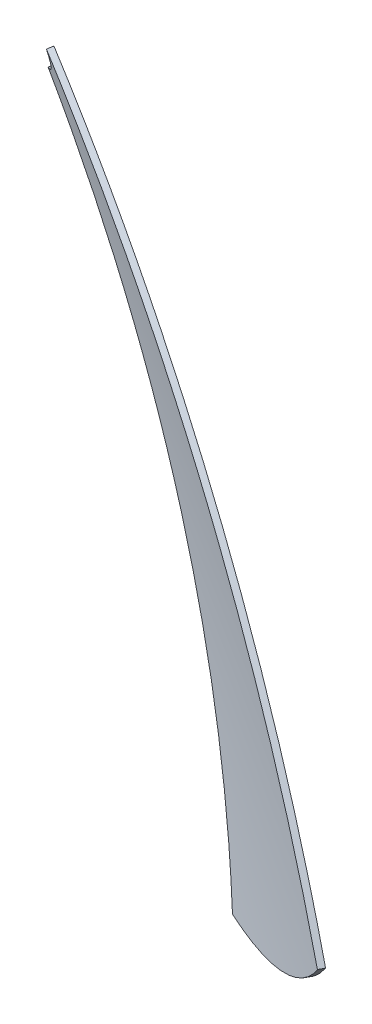
ISO-10303-21;
HEADER;
FILE_DESCRIPTION(('STEP AP214'),'2;1');
FILE_NAME('part.step','',(''),(''),'','','');
FILE_SCHEMA(('AUTOMOTIVE_DESIGN { 1 0 10303 214 1 1 1 1 }'));
ENDSEC;
DATA;
#1=APPLICATION_CONTEXT('core data for automotive mechanical design processes');
#2=APPLICATION_PROTOCOL_DEFINITION('international standard','automotive_design',2000,#1);
#3=PRODUCT_CONTEXT('',#1,'mechanical');
#4=PRODUCT('Part','Part','',(#3));
#5=PRODUCT_RELATED_PRODUCT_CATEGORY('part','',(#4));
#6=PRODUCT_DEFINITION_FORMATION('','',#4);
#7=PRODUCT_DEFINITION_CONTEXT('part definition',#1,'design');
#8=PRODUCT_DEFINITION('design','',#6,#7);
#9=PRODUCT_DEFINITION_SHAPE('','',#8);
#10=(LENGTH_UNIT() NAMED_UNIT(*) SI_UNIT(.MILLI.,.METRE.));
#11=(NAMED_UNIT(*) PLANE_ANGLE_UNIT() SI_UNIT($,.RADIAN.));
#12=(NAMED_UNIT(*) SI_UNIT($,.STERADIAN.) SOLID_ANGLE_UNIT());
#13=UNCERTAINTY_MEASURE_WITH_UNIT(LENGTH_MEASURE(1.E-05),#10,'distance_accuracy_value','');
#14=(GEOMETRIC_REPRESENTATION_CONTEXT(3) GLOBAL_UNCERTAINTY_ASSIGNED_CONTEXT((#13)) GLOBAL_UNIT_ASSIGNED_CONTEXT((#10,
#11,#12)) REPRESENTATION_CONTEXT('',''));
#15=CARTESIAN_POINT('',(0.,0.,0.));
#16=DIRECTION('',(0.,0.,1.));
#17=DIRECTION('',(1.,0.,0.));
#18=AXIS2_PLACEMENT_3D('',#15,#16,#17);
#19=CARTESIAN_POINT('',(92.8191394008508,-170.458872491296,-2.70380006520989));
#20=DIRECTION('',(0.,0.,1.));
#21=DIRECTION('',(1.,0.,0.));
#22=AXIS2_PLACEMENT_3D('',#19,#20,#21);
#23=CONICAL_SURFACE('',#22,60.5897364806191,0.959931088596881);
#24=CARTESIAN_POINT('',(152.398725099089,-159.865837266107,-2.75685890943688));
#25=CARTESIAN_POINT('',(152.336574594486,-159.74953897284,-2.78545030673104));
#26=CARTESIAN_POINT('',(152.274007170203,-159.633472462259,-2.81408465077512));
#27=CARTESIAN_POINT('',(151.959073791623,-159.054268987262,-2.95747727285969));
#28=CARTESIAN_POINT('',(151.700488657558,-158.594650234722,-3.07286613059215));
#29=CARTESIAN_POINT('',(151.170357344202,-157.683266643014,-3.30487159219547));
#30=CARTESIAN_POINT('',(150.898811179182,-157.231501795199,-3.42148819471435));
#31=CARTESIAN_POINT('',(150.48199364642,-156.560027960789,-3.59725956980415));
#32=CARTESIAN_POINT('',(150.34147682015,-156.337240420846,-3.65598890828657));
#33=CARTESIAN_POINT('',(149.91518196884,-155.671960401747,-3.832604308307));
#34=CARTESIAN_POINT('',(149.624679564232,-155.232583783193,-3.95090916930156));
#35=CARTESIAN_POINT('',(149.179708172621,-154.580088957937,-4.12913976000288));
#36=CARTESIAN_POINT('',(149.029853766096,-154.363693547814,-4.1886766334064));
#37=CARTESIAN_POINT('',(148.575674829862,-153.717788793499,-4.36768573612753));
#38=CARTESIAN_POINT('',(148.266756070885,-153.291593425314,-4.48754769873669));
#39=CARTESIAN_POINT('',(147.794412332155,-152.659280347937,-4.66807301856227));
#40=CARTESIAN_POINT('',(147.635476178773,-152.449680251862,-4.72836795087565));
#41=CARTESIAN_POINT('',(147.154168703976,-151.824384517337,-4.90964101311223));
#42=CARTESIAN_POINT('',(146.827321470728,-151.412225311476,-5.03099844670388));
#43=CARTESIAN_POINT('',(146.162024759803,-150.597669838701,-5.27461905538904));
#44=CARTESIAN_POINT('',(145.823575295453,-150.195273560573,-5.39688222944204));
#45=CARTESIAN_POINT('',(145.135410847417,-149.400473143817,-5.64218565509231));
#46=CARTESIAN_POINT('',(144.785695876165,-149.008068994161,-5.76522590583184));
#47=CARTESIAN_POINT('',(144.075317197601,-148.233518392532,-6.01197831877071));
#48=CARTESIAN_POINT('',(143.714653498024,-147.851371933312,-6.13569048049534));
#49=CARTESIAN_POINT('',(142.982682065742,-147.097606512934,-6.38369388464251));
#50=CARTESIAN_POINT('',(142.611374336475,-146.725987548375,-6.50798512687802));
#51=CARTESIAN_POINT('',(141.858406565963,-145.993561374871,-6.75707001258452));
#52=CARTESIAN_POINT('',(141.476746524202,-145.632754166468,-6.88186365608066));
#53=CARTESIAN_POINT('',(140.703363542617,-144.922252430132,-7.13188746750698));
#54=CARTESIAN_POINT('',(140.311640598607,-144.572557906822,-7.2571176356187));
#55=CARTESIAN_POINT('',(139.268389274935,-143.667767174082,-7.5870376220849));
#56=CARTESIAN_POINT('',(138.608735122322,-143.122138944729,-7.79205742776249));
#57=CARTESIAN_POINT('',(137.936618962161,-142.592357330095,-7.9975230269363));
#58=B_SPLINE_CURVE_WITH_KNOTS('',3,(#24,#25,#26,#27,#28,#29,#30,#31,#32,#33,#34,#35,#36,#37,#38,
#39,#40,#41,#42,#43,#44,#45,#46,#47,#48,#49,#50,#51,#52,#53,#54,#55,#56,#57),.UNSPECIFIED.,.F.,
.F.,(4,2,2,2,2,2,2,2,2,2,2,2,2,2,2,2,4),(0.,0.404785672243409,2.02408011369018,3.64337277215144,
4.45295892626697,6.07225043051863,6.88183655836591,8.50112857030588,9.31071486961127,
10.9300085585706,12.5493003875806,14.1685904295217,15.7878793275896,17.4071677026849,
19.0264561588341,20.6457452885118,23.2857183735523),.UNSPECIFIED.);
#59=CARTESIAN_POINT('',(152.398725099089,-159.865837266107,-2.75685890943712));
#60=VERTEX_POINT('',#59);
#61=CARTESIAN_POINT('',(137.936618962161,-142.592357330095,-7.99752302693631));
#62=VERTEX_POINT('',#61);
#63=EDGE_CURVE('E24',#60,#62,#58,.T.);
#64=ORIENTED_EDGE('',*,*,#63,.T.);
#65=CARTESIAN_POINT('',(137.936618962161,-142.592357330095,-7.99752302693651));
#66=CARTESIAN_POINT('',(137.878655188416,-142.691117877138,-8.06839270908306));
#67=CARTESIAN_POINT('',(137.819617741669,-142.789062852767,-8.13954595753132));
#68=CARTESIAN_POINT('',(137.519032649565,-143.274933729614,-8.49686090490927));
#69=CARTESIAN_POINT('',(137.261797471396,-143.650420376312,-8.78704423252981));
#70=CARTESIAN_POINT('',(136.830097638421,-144.223886184292,-9.25266430869265));
#71=CARTESIAN_POINT('',(136.665365674693,-144.431088054902,-9.42595602925785));
#72=CARTESIAN_POINT('',(136.423589909647,-144.719474364407,-9.67445744911181));
#73=CARTESIAN_POINT('',(136.350508164119,-144.804702893336,-9.74885104371632));
#74=CARTESIAN_POINT('',(136.021734580683,-145.179648827516,-10.0804026850167));
#75=CARTESIAN_POINT('',(135.756637133949,-145.459610570795,-10.3394946224096));
#76=CARTESIAN_POINT('',(135.402488923798,-145.806205515317,-10.6757424971141));
#77=CARTESIAN_POINT('',(135.322043952983,-145.883206989514,-10.7514987942421));
#78=CARTESIAN_POINT('',(134.966556291844,-146.215979556731,-11.0835807574503));
#79=CARTESIAN_POINT('',(134.683372040856,-146.461724706624,-11.341189489594));
#80=CARTESIAN_POINT('',(134.391589489127,-146.696069718829,-11.59999961285));
#81=B_SPLINE_CURVE_WITH_KNOTS('',3,(#65,#66,#67,#68,#69,#70,#71,#72,#73,#74,#75,#76,#77,#78,#79,
#80),.UNSPECIFIED.,.F.,.F.,(4,2,2,2,2,2,2,4),(0.,0.404039967204577,2.0213893371491,
2.97026784667457,3.37430460638701,4.76665393130004,5.17069019074886,6.5348899023175),.UNSPECIFIED.);
#82=CARTESIAN_POINT('',(134.391589487326,-146.696069720275,-11.5999996144475));
#83=VERTEX_POINT('',#82);
#84=EDGE_CURVE('E119',#62,#83,#81,.T.);
#85=ORIENTED_EDGE('',*,*,#84,.T.);
#86=CARTESIAN_POINT('',(134.391589485174,-146.696069721107,-11.5999996160451));
#87=CARTESIAN_POINT('',(134.459223065915,-146.814392834561,-11.5999996494661));
#88=CARTESIAN_POINT('',(134.526346230582,-146.933010458471,-11.6000047399864));
#89=CARTESIAN_POINT('',(134.859436645656,-147.527610959313,-11.6000530761269));
#90=CARTESIAN_POINT('',(135.117713968651,-148.007933380415,-11.6001649766073));
#91=CARTESIAN_POINT('',(135.617595351562,-148.97715725202,-11.6004735845131));
#92=CARTESIAN_POINT('',(135.85919943346,-149.46605869121,-11.6006702918267));
#93=CARTESIAN_POINT('',(136.325527939011,-150.451850812253,-11.6010958966145));
#94=CARTESIAN_POINT('',(136.550252381414,-150.94874148523,-11.6013247940529));
#95=CARTESIAN_POINT('',(136.982611111302,-151.949896784708,-11.6017712994741));
#96=CARTESIAN_POINT('',(137.190245414073,-152.454161404612,-11.601988907467));
#97=CARTESIAN_POINT('',(137.588233436813,-153.469479078157,-11.6023789968116));
#98=CARTESIAN_POINT('',(137.778587168387,-153.980532127239,-11.6025514781935));
#99=CARTESIAN_POINT('',(138.050989897135,-154.751675125658,-11.6027589088274));
#100=CARTESIAN_POINT('',(138.139598371038,-155.009469232641,-11.6028195018998));
#101=CARTESIAN_POINT('',(138.398863578129,-155.785127838502,-11.6029726866678));
#102=CARTESIAN_POINT('',(138.562939521934,-156.305213380311,-11.6030366646335));
#103=CARTESIAN_POINT('',(138.87334208877,-157.350635536463,-11.603079962301));
#104=CARTESIAN_POINT('',(139.019668713544,-157.875972150291,-11.6030592820111));
#105=CARTESIAN_POINT('',(139.294410333238,-158.931327291594,-11.6029358242971));
#106=CARTESIAN_POINT('',(139.422825325769,-159.461345819693,-11.6028330468619));
#107=CARTESIAN_POINT('',(139.601871565522,-160.259347737563,-11.6026274061371));
#108=CARTESIAN_POINT('',(139.659288201137,-160.525829583005,-11.6025502856918));
#109=CARTESIAN_POINT('',(139.824744966156,-161.326759891165,-11.6022970818032));
#110=CARTESIAN_POINT('',(139.925977990564,-161.8626354976,-11.6020991678294));
#111=CARTESIAN_POINT('',(140.110120815624,-162.937508813756,-11.6016733387557));
#112=CARTESIAN_POINT('',(140.193030603348,-163.476506525681,-11.6014454236347));
#113=CARTESIAN_POINT('',(140.34038163197,-164.557038133445,-11.600998195146));
#114=CARTESIAN_POINT('',(140.404822855735,-165.098572031636,-11.6007788817863));
#115=CARTESIAN_POINT('',(140.48751821096,-165.912227151599,-11.6004924206113));
#116=CARTESIAN_POINT('',(140.512754582088,-166.183656322819,-11.6004040220442));
#117=CARTESIAN_POINT('',(140.593605376919,-167.142587342302,-11.6001296377139));
#118=CARTESIAN_POINT('',(140.636607484771,-167.831159861272,-11.6000013307998));
#119=CARTESIAN_POINT('',(140.664536458546,-168.520475756909,-11.5999996160449));
#120=B_SPLINE_CURVE_WITH_KNOTS('',3,(#86,#87,#88,#89,#90,#91,#92,#93,#94,#95,#96,#97,#98,#99,
#100,#101,#102,#103,#104,#105,#106,#107,#108,#109,#110,#111,#112,#113,#114,#115,#116,#117,#118,
#119),.UNSPECIFIED.,.F.,.F.,(4,2,2,2,2,2,2,2,2,2,2,2,2,2,2,2,4),(0.,0.408872020546568,
2.04458806965262,3.68030196204773,5.31601403746416,6.95172464991032,8.58743416394008,
9.40520006693931,11.0409086322748,12.6766170368721,14.3123256596369,15.1300915889362,
16.765801245756,18.4015120568192,20.0372243852957,20.8549909104281,22.9242005441191),.UNSPECIFIED.);
#121=CARTESIAN_POINT('',(140.664536469763,-168.520475770829,-11.5999996085915));
#122=VERTEX_POINT('',#121);
#123=EDGE_CURVE('E69',#83,#122,#120,.T.);
#124=ORIENTED_EDGE('',*,*,#123,.T.);
#125=CARTESIAN_POINT('',(140.66453648098,-168.52047578475,-11.5999996011381));
#126=CARTESIAN_POINT('',(140.767038748587,-168.472575513016,-11.5269277903223));
#127=CARTESIAN_POINT('',(140.869368199467,-168.424201120752,-11.4539216330642));
#128=CARTESIAN_POINT('',(141.175831959128,-168.27762831105,-11.2350974279839));
#129=CARTESIAN_POINT('',(141.379425587943,-168.177987600055,-11.0894850958437));
#130=CARTESIAN_POINT('',(141.683660307701,-168.025556504144,-10.8715027837715));
#131=CARTESIAN_POINT('',(141.784886240841,-167.974247472363,-10.798909691186));
#132=CARTESIAN_POINT('',(141.986938824597,-167.870633160813,-10.6538741764911));
#133=CARTESIAN_POINT('',(142.087765467761,-167.818327862555,-10.5814317572058));
#134=CARTESIAN_POINT('',(142.390106125375,-167.65962334684,-10.3639913364422));
#135=CARTESIAN_POINT('',(142.590986778269,-167.551682762367,-10.2192341296152));
#136=CARTESIAN_POINT('',(142.991044699274,-167.331869367407,-9.9303437311623));
#137=CARTESIAN_POINT('',(143.190221915021,-167.219996436574,-9.78621055878622));
#138=CARTESIAN_POINT('',(143.586962859633,-166.992689078319,-9.49848968027459));
#139=CARTESIAN_POINT('',(143.784526449946,-166.877254349046,-9.35490202153411));
#140=CARTESIAN_POINT('',(144.177854311792,-166.64259699039,-9.06835939814929));
#141=CARTESIAN_POINT('',(144.373618594788,-166.523374385158,-8.92540442947766));
#142=CARTESIAN_POINT('',(144.763203172076,-166.280999269041,-8.64018539033869));
#143=CARTESIAN_POINT('',(144.957023504199,-166.157846834826,-8.49792130645469));
#144=CARTESIAN_POINT('',(145.342610031487,-165.90755530137,-8.21412074792206));
#145=CARTESIAN_POINT('',(145.53437620973,-165.780416169318,-8.07258427927293));
#146=CARTESIAN_POINT('',(146.106460978821,-165.393134464185,-7.6491088988452));
#147=CARTESIAN_POINT('',(146.483623176014,-165.127091898231,-7.36826203253392));
#148=CARTESIAN_POINT('',(147.04228371928,-164.717129671576,-6.94955383041514));
#149=CARTESIAN_POINT('',(147.227105055462,-164.578832322114,-6.81057731815191));
#150=CARTESIAN_POINT('',(147.594480572017,-164.298576195226,-6.53337820036422));
#151=CARTESIAN_POINT('',(147.777035009052,-164.156617838009,-6.39515551050309));
#152=CARTESIAN_POINT('',(148.321259609538,-163.725295322442,-5.98159483376346));
#153=CARTESIAN_POINT('',(148.679482383748,-163.430490089926,-5.70737074101098));
#154=CARTESIAN_POINT('',(149.38618013266,-162.826662747187,-5.16201900366931));
#155=CARTESIAN_POINT('',(149.734655084881,-162.51764060418,-4.89089136622257));
#156=CARTESIAN_POINT('',(150.249533314542,-162.043581954401,-4.48668211090644));
#157=CARTESIAN_POINT('',(150.419845446589,-161.883816342183,-4.35236598634263));
#158=CARTESIAN_POINT('',(150.899853402461,-161.424964290071,-3.97199681635292));
#159=CARTESIAN_POINT('',(151.206348153925,-161.121676738571,-3.72694448823466));
#160=CARTESIAN_POINT('',(151.809884374017,-160.502871268378,-3.23966273935938));
#161=CARTESIAN_POINT('',(152.106916132354,-160.187341479762,-2.99743637027885));
#162=CARTESIAN_POINT('',(152.398725099089,-159.865837266107,-2.75685890943743));
#163=B_SPLINE_CURVE_WITH_KNOTS('',3,(#125,#126,#127,#128,#129,#130,#131,#132,#133,#134,#135,
#136,#137,#138,#139,#140,#141,#142,#143,#144,#145,#146,#147,#148,#149,#150,#151,#152,#153,#154,
#155,#156,#157,#158,#159,#160,#161,#162),.UNSPECIFIED.,.F.,.F.,(4,2,2,2,2,2,2,2,2,2,2,2,2,2,2,2,
2,2,4),(0.,0.404064075306683,1.21225541412365,1.61640714753914,2.02056638872021,2.8308531042915,
3.64116463957878,4.45154503581638,5.26192026625542,6.07227969613828,6.8826457970962,
8.50313948334857,9.31144133405106,10.1196508173615,11.7361074941069,13.3525678987026,
14.1607180190769,15.6483257506211,17.1374137757609),.UNSPECIFIED.);
#164=EDGE_CURVE('E66',#122,#60,#163,.T.);
#165=ORIENTED_EDGE('',*,*,#164,.T.);
#166=EDGE_LOOP('',(#64,#85,#124,#165));
#167=FACE_BOUND('',#166,.T.);
#168=ADVANCED_FACE('F17',(#167),#23,.F.);
#169=CARTESIAN_POINT('',(138.035194653809,-142.531472701066,-8.16299173988277));
#170=CARTESIAN_POINT('',(138.034869321493,-142.531673640436,-8.16244563851991));
#171=CARTESIAN_POINT('',(138.034543989178,-142.531874579805,-8.16189953715705));
#172=CARTESIAN_POINT('',(138.034218656862,-142.532075519175,-8.16135343579419));
#173=CARTESIAN_POINT('',(138.001685425295,-142.552169456148,-8.10674329950826));
#174=CARTESIAN_POINT('',(137.969152193728,-142.572263393121,-8.05213316322233));
#175=CARTESIAN_POINT('',(137.936618962161,-142.592357330095,-7.9975230269364));
#176=CARTESIAN_POINT('',(141.425652158464,-145.207697592243,-7.12789737510283));
#177=CARTESIAN_POINT('',(141.425311467521,-145.20787367337,-7.12735127373997));
#178=CARTESIAN_POINT('',(141.424970776578,-145.208049754496,-7.12680517237711));
#179=CARTESIAN_POINT('',(141.424630085635,-145.208225835622,-7.12625907101425));
#180=CARTESIAN_POINT('',(141.390560991334,-145.22583394824,-7.07164893472832));
#181=CARTESIAN_POINT('',(141.356495909054,-145.243446081167,-7.01703879844239));
#182=CARTESIAN_POINT('',(141.322426814753,-145.261054193784,-6.96242866215646));
#183=CARTESIAN_POINT('',(146.855040655157,-150.64180884318,-5.31572204899934));
#184=CARTESIAN_POINT('',(146.854679006679,-150.641939790435,-5.31517594763648));
#185=CARTESIAN_POINT('',(146.854317358202,-150.642070737691,-5.31462984627362));
#186=CARTESIAN_POINT('',(146.853955709725,-150.642201684947,-5.31408374491076));
#187=CARTESIAN_POINT('',(146.817790862002,-150.655296410524,-5.25947360862483));
#188=CARTESIAN_POINT('',(146.781624590779,-150.66838936418,-5.2048634723389));
#189=CARTESIAN_POINT('',(146.745459743057,-150.681484089757,-5.15025333605297));
#190=CARTESIAN_POINT('',(151.003371937059,-157.017228221913,-3.61624611019748));
#191=CARTESIAN_POINT('',(151.002998821613,-157.017314088397,-3.61570000883462));
#192=CARTESIAN_POINT('',(151.002625706167,-157.017399954881,-3.61515390747176));
#193=CARTESIAN_POINT('',(151.002252590721,-157.017485821364,-3.6146078061089));
#194=CARTESIAN_POINT('',(150.96494104612,-157.026072469715,-3.55999766982296));
#195=CARTESIAN_POINT('',(150.927629938759,-157.034659808316,-3.50538753353703));
#196=CARTESIAN_POINT('',(150.890318394158,-157.043246456667,-3.4507773972511));
#197=CARTESIAN_POINT('',(152.512798547818,-159.845555418784,-2.92232762238332));
#198=CARTESIAN_POINT('',(152.51242206779,-159.845622355574,-2.92178152102046));
#199=CARTESIAN_POINT('',(152.512045587761,-159.845689292364,-2.9212354196576));
#200=CARTESIAN_POINT('',(152.511669107732,-159.845756229154,-2.92068931829474));
#201=CARTESIAN_POINT('',(152.474021104851,-159.852449908139,-2.8660791820088));
#202=CARTESIAN_POINT('',(152.43637310197,-159.859143587123,-2.81146904572287));
#203=CARTESIAN_POINT('',(152.398725099089,-159.865837266107,-2.75685890943694));
#204=B_SPLINE_SURFACE_WITH_KNOTS('',3,3,((#169,#170,#171,#172,#173,#174,#175),(#176,#177,#178,
#179,#180,#181,#182),(#183,#184,#185,#186,#187,#188,#189),(#190,#191,#192,#193,#194,#195,#196),
(#197,#198,#199,#200,#201,#202,#203)),.UNSPECIFIED.,.F.,.F.,.F.,(4,1,4),(4,3,4),(0.,
0.571428571428571,1.),(-0.01,0.,1.),.UNSPECIFIED.);
#205=DIRECTION('',(-0.487998473505722,-0.301409054594844,0.819152044289903));
#206=VECTOR('',#205,1.);
#207=CARTESIAN_POINT('',(137.984930811038,-142.562517833689,-8.078619079321));
#208=LINE('',#207,#206);
#209=CARTESIAN_POINT('',(138.031955557124,-142.53347400915,-8.15755361789342));
#210=VERTEX_POINT('',#209);
#211=EDGE_CURVE('E78',#210,#62,#208,.T.);
#212=DIRECTION('',(0.564720043215892,0.100405184759886,-0.819152044289443));
#213=VECTOR('',#212,1.);
#214=CARTESIAN_POINT('',(152.45519710341,-159.855796747631,-2.83877411386612));
#215=LINE('',#214,#213);
#216=CARTESIAN_POINT('',(152.511669113722,-159.845756222542,-2.92068931335494));
#217=VERTEX_POINT('',#216);
#218=EDGE_CURVE('E73',#60,#217,#215,.T.);
#219=CARTESIAN_POINT('',(138.031956055694,-142.533474402486,-8.15755346593899));
#220=CARTESIAN_POINT('',(138.133958108076,-142.613946645847,-8.12646529778272));
#221=CARTESIAN_POINT('',(138.23567539827,-142.694786061121,-8.09538663597653));
#222=CARTESIAN_POINT('',(138.74286271387,-143.100834171666,-7.94003119367087));
#223=CARTESIAN_POINT('',(139.144024853123,-143.431509233597,-7.81590162897688));
#224=CARTESIAN_POINT('',(139.936854598686,-144.104159723405,-7.56799587909311));
#225=CARTESIAN_POINT('',(140.328522214568,-144.446135139888,-7.44421969354719));
#226=CARTESIAN_POINT('',(141.10211009576,-145.141087209682,-7.19705770055076));
#227=CARTESIAN_POINT('',(141.484030367544,-145.494063855684,-7.07367189284102));
#228=CARTESIAN_POINT('',(142.23782948686,-146.210700728621,-6.82735417547374));
#229=CARTESIAN_POINT('',(142.609708337591,-146.574360952152,-6.70442226567162));
#230=CARTESIAN_POINT('',(143.710179152728,-147.681262017949,-6.33630065434827));
#231=CARTESIAN_POINT('',(144.423385897111,-148.440226051676,-6.0918551660268));
#232=CARTESIAN_POINT('',(145.460231152539,-149.608073277219,-5.72736513781131));
#233=CARTESIAN_POINT('',(145.80030642686,-150.002198188563,-5.60624843437447));
#234=CARTESIAN_POINT('',(146.469268050778,-150.800116367013,-5.36481666759996));
#235=CARTESIAN_POINT('',(146.798154387625,-151.203909645135,-5.24450160517589));
#236=CARTESIAN_POINT('',(147.282792001451,-151.816615278646,-5.06474493323933));
#237=CARTESIAN_POINT('',(147.44288360914,-152.02201224439,-5.00494750580863));
#238=CARTESIAN_POINT('',(147.918821995925,-152.641709406603,-4.8258995493583));
#239=CARTESIAN_POINT('',(148.230308492053,-153.05948658805,-4.7070020684499));
#240=CARTESIAN_POINT('',(148.688602686994,-153.692743102929,-4.52940098932274));
#241=CARTESIAN_POINT('',(148.839872816943,-153.904919222068,-4.47032695666553));
#242=CARTESIAN_POINT('',(149.588999594386,-154.971588607176,-4.17547259736474));
#243=CARTESIAN_POINT('',(150.164519676738,-155.84253851687,-3.94149603505636));
#244=CARTESIAN_POINT('',(151.031203875933,-157.238566977716,-3.57668863186143));
#245=CARTESIAN_POINT('',(151.339096050736,-157.75299850476,-3.44436226405994));
#246=CARTESIAN_POINT('',(151.938070772022,-158.791923012505,-3.18130308012235));
#247=CARTESIAN_POINT('',(152.229154075661,-159.31641553859,-3.05057019241769));
#248=CARTESIAN_POINT('',(152.511669081667,-159.845756180315,-2.92068933027747));
#249=B_SPLINE_CURVE_WITH_KNOTS('',3,(#219,#220,#221,#222,#223,#224,#225,#226,#227,#228,#229,
#230,#231,#232,#233,#234,#235,#236,#237,#238,#239,#240,#241,#242,#243,#244,#245,#246,#247,#248),
.UNSPECIFIED.,.F.,.F.,(4,2,2,2,2,2,2,2,2,2,2,2,2,2,4),(0.,0.400777793168243,2.00403338767079,
3.6072873657924,5.210540279051,6.8137926815609,10.021206154678,11.6244604469821,
13.2277165661383,14.0292868308906,15.6325435941857,16.4341136251853,19.6415493044878,
21.4831704092756,23.3247084935925),.UNSPECIFIED.);
#250=EDGE_CURVE('E113',#210,#217,#249,.T.);
#251=ORIENTED_EDGE('',*,*,#211,.T.);
#252=ORIENTED_EDGE('',*,*,#63,.F.);
#253=ORIENTED_EDGE('',*,*,#218,.T.);
#254=ORIENTED_EDGE('',*,*,#250,.F.);
#255=EDGE_LOOP('',(#251,#252,#253,#254));
#256=FACE_BOUND('',#255,.T.);
#257=ADVANCED_FACE('F75',(#256),#204,.F.);
#258=CARTESIAN_POINT('',(152.512798547818,-159.845555418785,-2.92232762238351));
#259=CARTESIAN_POINT('',(152.51242206779,-159.845622355575,-2.92178152102065));
#260=CARTESIAN_POINT('',(152.512045587761,-159.845689292365,-2.92123541965779));
#261=CARTESIAN_POINT('',(152.511669107732,-159.845756229155,-2.92068931829493));
#262=CARTESIAN_POINT('',(152.474021104851,-159.852449908139,-2.86607918200905));
#263=CARTESIAN_POINT('',(152.43637310197,-159.859143587123,-2.81146904572318));
#264=CARTESIAN_POINT('',(152.398725099089,-159.865837266107,-2.7568589094373));
#265=CARTESIAN_POINT('',(152.39834485426,-159.865904872265,-2.75630734706081));
#266=CARTESIAN_POINT('',(152.397964609431,-159.865972478422,-2.75575578468432));
#267=CARTESIAN_POINT('',(152.397584364602,-159.86604008458,-2.75520422230784));
#268=CARTESIAN_POINT('',(150.528199408807,-162.036381852905,-4.55903629348519));
#269=CARTESIAN_POINT('',(150.527820924411,-162.036437547474,-4.55849019212233));
#270=CARTESIAN_POINT('',(150.527442440015,-162.036493242042,-4.55794409075947));
#271=CARTESIAN_POINT('',(150.527063955619,-162.036548936611,-4.55739798939661));
#272=CARTESIAN_POINT('',(150.489215516025,-162.042118393461,-4.50278785311072));
#273=CARTESIAN_POINT('',(150.451369036456,-162.04768952524,-4.44817771682483));
#274=CARTESIAN_POINT('',(150.413520596862,-162.05325898209,-4.39356758053895));
#275=CARTESIAN_POINT('',(150.413138327622,-162.053315233604,-4.39301601816246));
#276=CARTESIAN_POINT('',(150.412756058382,-162.053371485118,-4.39246445578598));
#277=CARTESIAN_POINT('',(150.412373789142,-162.053427736633,-4.39191289340949));
#278=CARTESIAN_POINT('',(147.481898547952,-164.647709844893,-6.90069398417443));
#279=CARTESIAN_POINT('',(147.481518199987,-164.647750888598,-6.90014788281157));
#280=CARTESIAN_POINT('',(147.481137852022,-164.647791932303,-6.89960178144871));
#281=CARTESIAN_POINT('',(147.480757504057,-164.647832976008,-6.89905568008585));
#282=CARTESIAN_POINT('',(147.442722707543,-164.651937346507,-6.84444554379995));
#283=CARTESIAN_POINT('',(147.40468809159,-164.656043210816,-6.78983540751405));
#284=CARTESIAN_POINT('',(147.366653295077,-164.660147581315,-6.73522527122815));
#285=CARTESIAN_POINT('',(147.366269143632,-164.660189035457,-6.73467370885166));
#286=CARTESIAN_POINT('',(147.365884992187,-164.660230489599,-6.73412214647517));
#287=CARTESIAN_POINT('',(147.365500840743,-164.660271943741,-6.73357058409869));
#288=CARTESIAN_POINT('',(144.13077960376,-166.753318989047,-9.35522480321198));
#289=CARTESIAN_POINT('',(144.130398200237,-166.753346621542,-9.35467870184912));
#290=CARTESIAN_POINT('',(144.130016796713,-166.753374254037,-9.35413260048626));
#291=CARTESIAN_POINT('',(144.129635393189,-166.753401886532,-9.3535864991234));
#292=CARTESIAN_POINT('',(144.091495040811,-166.756165136019,-9.29897636283748));
#293=CARTESIAN_POINT('',(144.053354298153,-166.758925503744,-9.24436622655156));
#294=CARTESIAN_POINT('',(144.015213945775,-166.761688753231,-9.18975609026564));
#295=CARTESIAN_POINT('',(144.014828728216,-166.761716662051,-9.18920452788915));
#296=CARTESIAN_POINT('',(144.014443510657,-166.761744570871,-9.18865296551266));
#297=CARTESIAN_POINT('',(144.014058293098,-166.76177247969,-9.18810140313618));
#298=CARTESIAN_POINT('',(142.332394023188,-167.75751850005,-10.65580747319));
#299=CARTESIAN_POINT('',(142.332012195357,-167.757539374067,-10.6552613718271));
#300=CARTESIAN_POINT('',(142.331630367526,-167.757560248085,-10.6547152704643));
#301=CARTESIAN_POINT('',(142.331248539695,-167.757581122102,-10.6541691691014));
#302=CARTESIAN_POINT('',(142.293065756601,-167.759668523851,-10.5995590328154));
#303=CARTESIAN_POINT('',(142.25488356675,-167.761759082068,-10.5449488965295));
#304=CARTESIAN_POINT('',(142.216700783656,-167.763846483817,-10.4903387602436));
#305=CARTESIAN_POINT('',(142.216315137547,-167.763867566575,-10.4897871978671));
#306=CARTESIAN_POINT('',(142.215929491438,-167.763888649332,-10.4892356354906));
#307=CARTESIAN_POINT('',(142.215543845328,-167.76390973209,-10.4886840731141));
#308=CARTESIAN_POINT('',(141.409213813577,-168.221227425108,-11.3171126533402));
#309=CARTESIAN_POINT('',(141.408831831925,-168.221245060874,-11.3165665519773));
#310=CARTESIAN_POINT('',(141.408449850274,-168.221262696641,-11.3160204506145));
#311=CARTESIAN_POINT('',(141.408067868623,-168.221280332408,-11.3154743492516));
#312=CARTESIAN_POINT('',(141.369869703503,-168.223043909085,-11.2608642129657));
#313=CARTESIAN_POINT('',(141.331670785801,-168.224802504251,-11.2062540766797));
#314=CARTESIAN_POINT('',(141.293472620682,-168.226566080929,-11.1516439403938));
#315=CARTESIAN_POINT('',(141.293086819214,-168.226583893053,-11.1510923780173));
#316=CARTESIAN_POINT('',(141.292701017747,-168.226601705178,-11.1505408156408));
#317=CARTESIAN_POINT('',(141.292315216279,-168.226619517302,-11.1499892532643));
#318=CARTESIAN_POINT('',(140.78030395868,-168.51578560654,-11.7654683091632));
#319=CARTESIAN_POINT('',(140.779921887819,-168.515801085665,-11.7649222078003));
#320=CARTESIAN_POINT('',(140.779539816959,-168.515816564791,-11.7643761064375));
#321=CARTESIAN_POINT('',(140.779157746098,-168.515832043916,-11.7638300050746));
#322=CARTESIAN_POINT('',(140.740950660027,-168.517379956452,-11.7092198687886));
#323=CARTESIAN_POINT('',(140.702743573956,-168.518927868988,-11.6546097325027));
#324=CARTESIAN_POINT('',(140.664536487884,-168.520475781524,-11.5999995962168));
#325=CARTESIAN_POINT('',(140.664150596315,-168.520491415441,-11.5994480338403));
#326=CARTESIAN_POINT('',(140.663764704745,-168.520507049357,-11.5988964714638));
#327=CARTESIAN_POINT('',(140.663378813176,-168.520522683274,-11.5983449090873));
#328=B_SPLINE_SURFACE_WITH_KNOTS('',3,3,((#258,#259,#260,#261,#262,#263,#264,#265,#266,#267),
(#268,#269,#270,#271,#272,#273,#274,#275,#276,#277),(#278,#279,#280,#281,#282,#283,#284,#285,
#286,#287),(#288,#289,#290,#291,#292,#293,#294,#295,#296,#297),(#298,#299,#300,#301,#302,#303,
#304,#305,#306,#307),(#308,#309,#310,#311,#312,#313,#314,#315,#316,#317),(#318,#319,#320,#321,
#322,#323,#324,#325,#326,#327)),.UNSPECIFIED.,.F.,.F.,.F.,(4,1,1,1,4),(4,3,3,4),(0.,
0.571428571428571,0.785714285714286,0.857142857142857,1.),(-0.01,0.,1.,1.0101),.UNSPECIFIED.);
#329=DIRECTION('',(0.573106291045731,0.0232186883339719,-0.81915204429694));
#330=VECTOR('',#329,1.);
#331=CARTESIAN_POINT('',(140.722871009964,-168.518112380455,-11.6833783341114));
#332=LINE('',#331,#330);
#333=CARTESIAN_POINT('',(140.77881141617,-168.515845963771,-11.7633350556312));
#334=VERTEX_POINT('',#333);
#335=EDGE_CURVE('E84',#122,#334,#332,.T.);
#336=CARTESIAN_POINT('',(152.511669119713,-159.84575621593,-2.92068930841479));
#337=CARTESIAN_POINT('',(152.433343624917,-159.93221837911,-2.98528436387934));
#338=CARTESIAN_POINT('',(152.354638487971,-160.018249675058,-3.04999990062433));
#339=CARTESIAN_POINT('',(151.959206463639,-160.446300032354,-3.37420314928588));
#340=CARTESIAN_POINT('',(151.636890722147,-160.781856117291,-3.635460004296));
#341=CARTESIAN_POINT('',(150.980385585857,-161.440067874898,-4.16211471847004));
#342=CARTESIAN_POINT('',(150.646167007364,-161.762687031058,-4.42752171173098));
#343=CARTESIAN_POINT('',(149.967371823427,-162.394100719355,-4.96160284684879));
#344=CARTESIAN_POINT('',(149.622794392874,-162.702894145336,-5.23027724794265));
#345=CARTESIAN_POINT('',(148.923958785591,-163.306492315596,-5.7706899621517));
#346=CARTESIAN_POINT('',(148.569700873726,-163.601297442005,-6.04242819131863));
#347=CARTESIAN_POINT('',(147.852057815275,-164.17665856282,-6.58883989015164));
#348=CARTESIAN_POINT('',(147.488673575012,-164.45721596385,-6.86351306680798));
#349=CARTESIAN_POINT('',(146.937585082727,-164.866685154163,-7.27730280054837));
#350=CARTESIAN_POINT('',(146.753141956152,-165.001105172015,-7.41534032668559));
#351=CARTESIAN_POINT('',(146.382114728125,-165.266251824685,-7.69214910777209));
#352=CARTESIAN_POINT('',(146.195530378988,-165.396978026042,-7.83092044658317));
#353=CARTESIAN_POINT('',(145.820276636887,-165.654632661717,-8.1091862431694));
#354=CARTESIAN_POINT('',(145.631607166614,-165.781560954571,-8.24868072765351));
#355=CARTESIAN_POINT('',(145.252240462207,-166.031532777939,-8.52838368559937));
#356=CARTESIAN_POINT('',(145.061543259047,-166.154576367677,-8.66859214813796));
#357=CARTESIAN_POINT('',(144.6782164956,-166.396806006136,-8.94969410238822));
#358=CARTESIAN_POINT('',(144.485586946671,-166.515992077511,-9.09058759007114));
#359=CARTESIAN_POINT('',(144.098521255252,-166.750599348959,-9.37301160022899));
#360=CARTESIAN_POINT('',(143.904085154773,-166.866020636303,-9.51454210785065));
#361=CARTESIAN_POINT('',(143.513579486985,-167.093357350156,-9.79816374790791));
#362=CARTESIAN_POINT('',(143.317509916413,-167.205272769664,-9.94025488146264));
#363=CARTESIAN_POINT('',(142.92863365823,-167.422721213099,-10.2214804891916));
#364=CARTESIAN_POINT('',(142.735866807764,-167.528343709243,-10.3606007916761));
#365=CARTESIAN_POINT('',(142.348729306356,-167.735776349884,-10.6394490298489));
#366=CARTESIAN_POINT('',(142.15435866533,-167.837586517928,-10.7791769617779));
#367=CARTESIAN_POINT('',(141.763937184816,-168.037589122467,-11.0593333363664));
#368=CARTESIAN_POINT('',(141.56788491784,-168.135778010683,-11.1997623206342));
#369=CARTESIAN_POINT('',(141.174376465193,-168.328519287299,-11.4811559957408));
#370=CARTESIAN_POINT('',(140.976920257371,-168.423071618172,-11.6221206950153));
#371=CARTESIAN_POINT('',(140.778811567593,-168.515846018152,-11.7633349512189));
#372=B_SPLINE_CURVE_WITH_KNOTS('',3,(#336,#337,#338,#339,#340,#341,#342,#343,#344,#345,#346,
#347,#348,#349,#350,#351,#352,#353,#354,#355,#356,#357,#358,#359,#360,#361,#362,#363,#364,#365,
#366,#367,#368,#369,#370,#371),.UNSPECIFIED.,.F.,.F.,(4,2,2,2,2,2,2,2,2,2,2,2,2,2,2,2,2,4),(0.,
0.400064412365374,2.00054436126846,3.60526274444745,5.21010928798252,6.81491196540041,
8.41955589748357,9.21970311979081,10.0199438511065,10.8202143524903,11.6204726471065,
12.4207262409608,13.2209612711379,14.0211978995606,14.8015681174374,15.5819335142851,
16.363044260918,17.1441673588068),.UNSPECIFIED.);
#373=EDGE_CURVE('E81',#217,#334,#372,.T.);
#374=ORIENTED_EDGE('',*,*,#218,.F.);
#375=ORIENTED_EDGE('',*,*,#164,.F.);
#376=ORIENTED_EDGE('',*,*,#335,.T.);
#377=ORIENTED_EDGE('',*,*,#373,.F.);
#378=EDGE_LOOP('',(#374,#375,#376,#377));
#379=FACE_BOUND('',#378,.T.);
#380=ADVANCED_FACE('F79',(#379),#328,.F.);
#381=CARTESIAN_POINT('',(140.781205293752,-168.515749039525,-11.7667566682227));
#382=CARTESIAN_POINT('',(140.780522857297,-168.515776687589,-11.7657812484344));
#383=CARTESIAN_POINT('',(140.779840420842,-168.515804335653,-11.7648058286461));
#384=CARTESIAN_POINT('',(140.779157984387,-168.515831983717,-11.7638304088578));
#385=CARTESIAN_POINT('',(140.740950898317,-168.517379896273,-11.7092202725719));
#386=CARTESIAN_POINT('',(140.702743812246,-168.518927808828,-11.6546101362859));
#387=CARTESIAN_POINT('',(140.664536726176,-168.520475721384,-11.6));
#388=CARTESIAN_POINT('',(140.664147830951,-168.52049147699,-11.5994441444393));
#389=CARTESIAN_POINT('',(140.663758935726,-168.520507232596,-11.5988882888785));
#390=CARTESIAN_POINT('',(140.6633700405,-168.520522988203,-11.5983324333178));
#391=CARTESIAN_POINT('',(140.471093761647,-160.861266278925,-11.7667566682227));
#392=CARTESIAN_POINT('',(140.470415632891,-160.861402865824,-11.7657812484344));
#393=CARTESIAN_POINT('',(140.469737504136,-160.861539452722,-11.7648058286461));
#394=CARTESIAN_POINT('',(140.46905937538,-160.861676039621,-11.7638304088578));
#395=CARTESIAN_POINT('',(140.431093461419,-160.869323033495,-11.7092202725719));
#396=CARTESIAN_POINT('',(140.393145146196,-160.876965707641,-11.6546101362859));
#397=CARTESIAN_POINT('',(140.355179232234,-160.884612701514,-11.6));
#398=CARTESIAN_POINT('',(140.354792791807,-160.884690537322,-11.5994441444393));
#399=CARTESIAN_POINT('',(140.35440635138,-160.884768373129,-11.5988882888785));
#400=CARTESIAN_POINT('',(140.354019910952,-160.884846208937,-11.5983324333178));
#401=CARTESIAN_POINT('',(138.294622961249,-153.289038643553,-11.7667566682227));
#402=CARTESIAN_POINT('',(138.293975803115,-153.289282981312,-11.7657812484344));
#403=CARTESIAN_POINT('',(138.293328644982,-153.28952731907,-11.7648058286461));
#404=CARTESIAN_POINT('',(138.292681486848,-153.289771656828,-11.7638304088578));
#405=CARTESIAN_POINT('',(138.256449503147,-153.303451221707,-11.7092202725719));
#406=CARTESIAN_POINT('',(138.220234725972,-153.317125102303,-11.6546101362859));
#407=CARTESIAN_POINT('',(138.18400274227,-153.330804667182,-11.6));
#408=CARTESIAN_POINT('',(138.183633950852,-153.330943906208,-11.5994441444393));
#409=CARTESIAN_POINT('',(138.183265159433,-153.331083145235,-11.5988882888785));
#410=CARTESIAN_POINT('',(138.182896368015,-153.331222384261,-11.5983324333178));
#411=CARTESIAN_POINT('',(134.492962023971,-146.638125201579,-11.7667566682227));
#412=CARTESIAN_POINT('',(134.492369060861,-146.638464139155,-11.7657812484344));
#413=CARTESIAN_POINT('',(134.49177609775,-146.63880307673,-11.7648058286461));
#414=CARTESIAN_POINT('',(134.49118313464,-146.639142014306,-11.7638304088578));
#415=CARTESIAN_POINT('',(134.457985329287,-146.658117872101,-11.7092202725719));
#416=CARTESIAN_POINT('',(134.424787523935,-146.677093729896,-11.6546101362859));
#417=CARTESIAN_POINT('',(134.391589718582,-146.696069587691,-11.6));
#418=CARTESIAN_POINT('',(134.391251810897,-146.696262735645,-11.5994441444393));
#419=CARTESIAN_POINT('',(134.390913903213,-146.696455883598,-11.5988882888785));
#420=CARTESIAN_POINT('',(134.390575995528,-146.696649031552,-11.5983324333178));
#421=B_SPLINE_SURFACE_WITH_KNOTS('',3,3,((#381,#382,#383,#384,#385,#386,#387,#388,#389,#390),
(#391,#392,#393,#394,#395,#396,#397,#398,#399,#400),(#401,#402,#403,#404,#405,#406,#407,#408,
#409,#410),(#411,#412,#413,#414,#415,#416,#417,#418,#419,#420)),.UNSPECIFIED.,.F.,.F.,.F.,(4,4),
(4,3,3,4),(0.,1.),(-0.0178615153641326,0.,1.,1.01017861515364),.UNSPECIFIED.);
#422=DIRECTION('',(0.497967080293421,0.284637866924026,-0.819152044285422));
#423=VECTOR('',#422,1.);
#424=CARTESIAN_POINT('',(134.440888229996,-146.667890570067,-11.6810956653056));
#425=LINE('',#424,#423);
#426=CARTESIAN_POINT('',(134.489266334076,-146.640237668287,-11.7606773996097));
#427=VERTEX_POINT('',#426);
#428=EDGE_CURVE('E45',#83,#427,#425,.T.);
#429=CARTESIAN_POINT('',(140.778811413721,-168.515845903144,-11.7633350556401));
#430=CARTESIAN_POINT('',(140.773308959417,-168.379668139206,-11.7633558068638));
#431=CARTESIAN_POINT('',(140.767218555943,-168.243511745494,-11.7633809560979));
#432=CARTESIAN_POINT('',(140.733828241293,-167.562788869923,-11.763526308544));
#433=CARTESIAN_POINT('',(140.697721961496,-167.018626750673,-11.7637052995401));
#434=CARTESIAN_POINT('',(140.606855028336,-165.931880295083,-11.76412722902));
#435=CARTESIAN_POINT('',(140.552094399403,-165.389295956679,-11.76437016742));
#436=CARTESIAN_POINT('',(140.42405640996,-164.306312520912,-11.7648675373775));
#437=CARTESIAN_POINT('',(140.35077906989,-163.765913421137,-11.7651219689224));
#438=CARTESIAN_POINT('',(140.185855354627,-162.687931652164,-11.7655989597018));
#439=CARTESIAN_POINT('',(140.094208995775,-162.15034898046,-11.7658215189647));
#440=CARTESIAN_POINT('',(139.892696173278,-161.078595496651,-11.7662009936024));
#441=CARTESIAN_POINT('',(139.782829721819,-160.544424682264,-11.7663579090211));
#442=CARTESIAN_POINT('',(139.604502843721,-159.746261936916,-11.7665266172822));
#443=CARTESIAN_POINT('',(139.542809725015,-159.480737564661,-11.766571741919));
#444=CARTESIAN_POINT('',(139.350972809528,-158.685713799091,-11.766670824836));
#445=CARTESIAN_POINT('',(139.214083292895,-158.157821314166,-11.7666884745784));
#446=CARTESIAN_POINT('',(138.922501707964,-157.10699500971,-11.7666185410446));
#447=CARTESIAN_POINT('',(138.767809641466,-156.584061189676,-11.766530957779));
#448=CARTESIAN_POINT('',(138.440787083199,-155.543718886584,-11.7662530006031));
#449=CARTESIAN_POINT('',(138.268456589169,-155.026310404233,-11.7660626266796));
#450=CARTESIAN_POINT('',(137.996895961907,-154.254870965783,-11.7657099629096));
#451=CARTESIAN_POINT('',(137.904203616774,-153.998517050642,-11.7655812332469));
#452=CARTESIAN_POINT('',(137.619591172817,-153.231796514642,-11.765165330153));
#453=CARTESIAN_POINT('',(137.421154340196,-152.723827175088,-11.7648484640791));
#454=CARTESIAN_POINT('',(137.007120082813,-151.714949087188,-11.764163552094));
#455=CARTESIAN_POINT('',(136.791522646121,-151.214040343752,-11.7637955061473));
#456=CARTESIAN_POINT('',(136.343354512558,-150.219855120264,-11.763046562488));
#457=CARTESIAN_POINT('',(136.110783800151,-149.726578647199,-11.7626656647637));
#458=CARTESIAN_POINT('',(135.749390466662,-148.992911715244,-11.7621205348444));
#459=CARTESIAN_POINT('',(135.626843514445,-148.749410498088,-11.7619432032866));
#460=CARTESIAN_POINT('',(135.178539420448,-147.877342870707,-11.7613338814468));
#461=CARTESIAN_POINT('',(134.840828153812,-147.254912832857,-11.7609475150607));
#462=CARTESIAN_POINT('',(134.489266951512,-146.640238633304,-11.7606773602365));
#463=B_SPLINE_CURVE_WITH_KNOTS('',3,(#429,#430,#431,#432,#433,#434,#435,#436,#437,#438,#439,
#440,#441,#442,#443,#444,#445,#446,#447,#448,#449,#450,#451,#452,#453,#454,#455,#456,#457,#458,
#459,#460,#461,#462),.UNSPECIFIED.,.F.,.F.,(4,2,2,2,2,2,2,2,2,2,2,2,2,2,2,2,4),(0.,
0.408872008181509,2.04458727352688,3.68030039673812,5.31601171428384,6.95172157673775,
8.5874303451,9.40519615507485,11.0409039744136,12.6766116282158,14.3123194917523,
15.1300853250108,16.7657942033159,18.4015042187763,20.0372157314028,20.8549821522559,
22.9788418860402),.UNSPECIFIED.);
#464=EDGE_CURVE('E36',#334,#427,#463,.T.);
#465=ORIENTED_EDGE('',*,*,#335,.F.);
#466=ORIENTED_EDGE('',*,*,#123,.F.);
#467=ORIENTED_EDGE('',*,*,#428,.T.);
#468=ORIENTED_EDGE('',*,*,#464,.F.);
#469=EDGE_LOOP('',(#465,#466,#467,#468));
#470=FACE_BOUND('',#469,.T.);
#471=ADVANCED_FACE('F138',(#470),#421,.F.);
#472=CARTESIAN_POINT('',(134.449854136419,-146.672353091507,-11.8004941054633));
#473=CARTESIAN_POINT('',(134.416653042851,-146.691323210062,-11.7458839691774));
#474=CARTESIAN_POINT('',(134.383451942073,-146.710293275764,-11.6912738328915));
#475=CARTESIAN_POINT('',(134.350250848505,-146.729263394319,-11.6366636966056));
#476=CARTESIAN_POINT('',(134.349918837569,-146.729453095504,-11.6361175952428));
#477=CARTESIAN_POINT('',(134.349586826634,-146.72964279669,-11.6355714938799));
#478=CARTESIAN_POINT('',(134.349254815698,-146.729832497875,-11.635025392517));
#479=CARTESIAN_POINT('',(134.463630392648,-146.661282776174,-11.7882727442351));
#480=CARTESIAN_POINT('',(134.430430395151,-146.680254807809,-11.7336626079492));
#481=CARTESIAN_POINT('',(134.397230392849,-146.699226804209,-11.6790524716633));
#482=CARTESIAN_POINT('',(134.364030395352,-146.718198835843,-11.6244423353774));
#483=CARTESIAN_POINT('',(134.363698395377,-146.71838855616,-11.6238962340146));
#484=CARTESIAN_POINT('',(134.363366395402,-146.718578276476,-11.6233501326517));
#485=CARTESIAN_POINT('',(134.363034395428,-146.718767996793,-11.6228040312888));
#486=CARTESIAN_POINT('',(134.477406648876,-146.650212460841,-11.7760513830069));
#487=CARTESIAN_POINT('',(134.444207747452,-146.669186405556,-11.721441246721));
#488=CARTESIAN_POINT('',(134.411008843624,-146.688160332653,-11.6668311104351));
#489=CARTESIAN_POINT('',(134.3778099422,-146.707134277368,-11.6122209741492));
#490=CARTESIAN_POINT('',(134.377477953185,-146.707324016815,-11.6116748727863));
#491=CARTESIAN_POINT('',(134.377145964171,-146.707513756263,-11.6111287714235));
#492=CARTESIAN_POINT('',(134.376813975157,-146.70770349571,-11.6105826700606));
#493=CARTESIAN_POINT('',(134.491182905105,-146.639142145508,-11.7638300217787));
#494=CARTESIAN_POINT('',(134.457985099752,-146.658118003303,-11.7092198854928));
#495=CARTESIAN_POINT('',(134.4247872944,-146.677093861098,-11.6546097492069));
#496=CARTESIAN_POINT('',(134.391589489047,-146.696069718893,-11.599999612921));
#497=CARTESIAN_POINT('',(134.391257510993,-146.696259477471,-11.5994535115581));
#498=CARTESIAN_POINT('',(134.39092553294,-146.696449236049,-11.5989074101953));
#499=CARTESIAN_POINT('',(134.390593554886,-146.696638994627,-11.5983613088324));
#500=CARTESIAN_POINT('',(135.868808527968,-145.532110612193,-10.5416938989583));
#501=CARTESIAN_POINT('',(135.835720329791,-145.55127777799,-10.4870837626723));
#502=CARTESIAN_POINT('',(135.802632371954,-145.570446705574,-10.4324736263864));
#503=CARTESIAN_POINT('',(135.769544173777,-145.589613871372,-10.3778634901005));
#504=CARTESIAN_POINT('',(135.769213291795,-145.58980554303,-10.3773173887376));
#505=CARTESIAN_POINT('',(135.768882409814,-145.589997214688,-10.3767712873748));
#506=CARTESIAN_POINT('',(135.768551527832,-145.590188886346,-10.3762251860119));
#507=CARTESIAN_POINT('',(137.096060163327,-144.133882517519,-9.30963726457911));
#508=CARTESIAN_POINT('',(137.063198076864,-144.15344369673,-9.25502712829318));
#509=CARTESIAN_POINT('',(137.030335909948,-144.173005714395,-9.20041699200724));
#510=CARTESIAN_POINT('',(136.997473823485,-144.192566893606,-9.1458068557213));
#511=CARTESIAN_POINT('',(136.99714520262,-144.192762505398,-9.14526075435844));
#512=CARTESIAN_POINT('',(136.996816581756,-144.19295811719,-9.14471465299558));
#513=CARTESIAN_POINT('',(136.996487960891,-144.193153728982,-9.14416855163272));
#514=CARTESIAN_POINT('',(138.034218656862,-142.532075519175,-8.1613534357942));
#515=CARTESIAN_POINT('',(138.001685425295,-142.552169456148,-8.10674329950826));
#516=CARTESIAN_POINT('',(137.969152193728,-142.572263393121,-8.05213316322233));
#517=CARTESIAN_POINT('',(137.936618962161,-142.592357330095,-7.99752302693639));
#518=CARTESIAN_POINT('',(137.936293629845,-142.592558269465,-7.99697692557353));
#519=CARTESIAN_POINT('',(137.93596829753,-142.592759208834,-7.99643082421067));
#520=CARTESIAN_POINT('',(137.935642965214,-142.592960148204,-7.99588472284781));
#521=B_SPLINE_SURFACE_WITH_KNOTS('',3,3,((#472,#473,#474,#475,#476,#477,#478),(#479,#480,#481,
#482,#483,#484,#485),(#486,#487,#488,#489,#490,#491,#492),(#493,#494,#495,#496,#497,#498,#499),
(#500,#501,#502,#503,#504,#505,#506),(#507,#508,#509,#510,#511,#512,#513),(#514,#515,#516,#517,
#518,#519,#520)),.UNSPECIFIED.,.F.,.F.,.F.,(4,3,4),(4,3,4),(-0.01,0.,1.),(0.,1.,1.01),.UNSPECIFIED.);
#522=CARTESIAN_POINT('',(134.489266285685,-146.640237707172,-11.7606774425444));
#523=CARTESIAN_POINT('',(134.575600936892,-146.570857228525,-11.6840754557335));
#524=CARTESIAN_POINT('',(134.661205663589,-146.500449620815,-11.6075539071547));
#525=CARTESIAN_POINT('',(135.085714946915,-146.143184170506,-11.225216429416));
#526=CARTESIAN_POINT('',(135.413399051503,-145.841180131876,-10.920809356129));
#527=CARTESIAN_POINT('',(135.885361052286,-145.365719683185,-10.4677096114166));
#528=CARTESIAN_POINT('',(136.039434268809,-145.203474547348,-10.3172478596216));
#529=CARTESIAN_POINT('',(136.340809125787,-144.871655914601,-10.0176280224111));
#530=CARTESIAN_POINT('',(136.488110880145,-144.70208254105,-9.86846991510149));
#531=CARTESIAN_POINT('',(136.889314590328,-144.218857110693,-9.45426245581769));
#532=CARTESIAN_POINT('',(137.135439252956,-143.897272972994,-9.19080597902826));
#533=CARTESIAN_POINT('',(137.486013431013,-143.398298279735,-8.7999511910136));
#534=CARTESIAN_POINT('',(137.599818393497,-143.229123661253,-8.67032809449911));
#535=CARTESIAN_POINT('',(137.820876142905,-142.885349939315,-8.4126970872526));
#536=CARTESIAN_POINT('',(137.928128881126,-142.710750795555,-8.28468918853166));
#537=CARTESIAN_POINT('',(138.03195487858,-142.533473923127,-8.15755399023425));
#538=B_SPLINE_CURVE_WITH_KNOTS('',3,(#522,#523,#524,#525,#526,#527,#528,#529,#530,#531,#532,
#533,#534,#535,#536,#537),.UNSPECIFIED.,.F.,.F.,(4,2,2,2,2,2,2,4),(0.,0.404036753515054,
2.02123421461518,2.8299814075773,3.63871499174272,5.08673532584589,5.81142609315458,
6.53612224630137),.UNSPECIFIED.);
#539=EDGE_CURVE('E11',#427,#210,#538,.T.);
#540=ORIENTED_EDGE('',*,*,#428,.F.);
#541=ORIENTED_EDGE('',*,*,#84,.F.);
#542=ORIENTED_EDGE('',*,*,#211,.F.);
#543=ORIENTED_EDGE('',*,*,#539,.F.);
#544=EDGE_LOOP('',(#540,#541,#542,#543));
#545=FACE_BOUND('',#544,.T.);
#546=ADVANCED_FACE('F19',(#545),#521,.F.);
#547=CARTESIAN_POINT('',(92.932083409494,-170.438791454343,-2.86762305109171));
#548=DIRECTION('',(0.,0.,1.));
#549=DIRECTION('',(1.,0.,0.));
#550=AXIS2_PLACEMENT_3D('',#547,#548,#549);
#551=CONICAL_SURFACE('',#550,60.5897470817274,0.959931088596881);
#552=ORIENTED_EDGE('',*,*,#464,.T.);
#553=ORIENTED_EDGE('',*,*,#539,.T.);
#554=ORIENTED_EDGE('',*,*,#250,.T.);
#555=ORIENTED_EDGE('',*,*,#373,.T.);
#556=EDGE_LOOP('',(#552,#553,#554,#555));
#557=FACE_BOUND('',#556,.T.);
#558=ADVANCED_FACE('F99',(#557),#551,.T.);
#559=CLOSED_SHELL('',(#168,#257,#380,#471,#546,#558));
#560=MANIFOLD_SOLID_BREP('B1',#559);
#561=ADVANCED_BREP_SHAPE_REPRESENTATION('',(#18,#560),#14);
#562=SHAPE_DEFINITION_REPRESENTATION(#9,#561);
ENDSEC;
END-ISO-10303-21;
